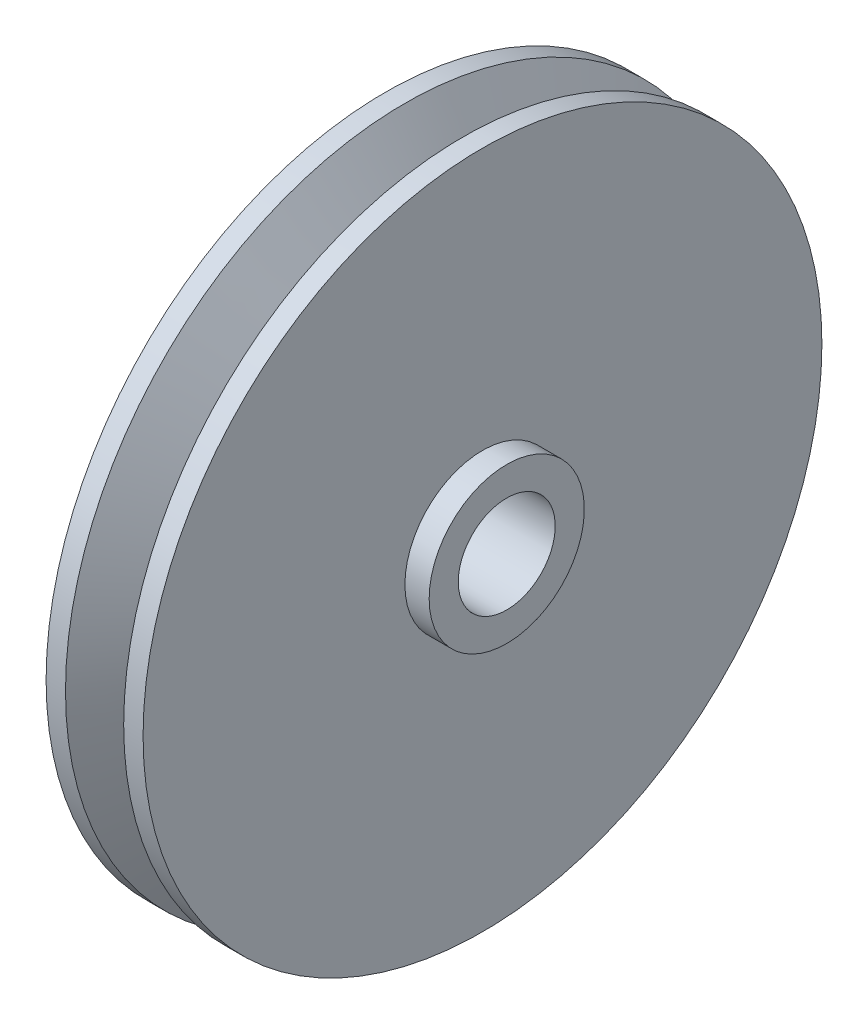
ISO-10303-21;
HEADER;
FILE_DESCRIPTION(('STEP AP214'),'2;1');
FILE_NAME('part.step','',(''),(''),'','','');
FILE_SCHEMA(('AUTOMOTIVE_DESIGN { 1 0 10303 214 1 1 1 1 }'));
ENDSEC;
DATA;
#1=APPLICATION_CONTEXT('core data for automotive mechanical design processes');
#2=APPLICATION_PROTOCOL_DEFINITION('international standard','automotive_design',2000,#1);
#3=PRODUCT_CONTEXT('',#1,'mechanical');
#4=PRODUCT('Part','Part','',(#3));
#5=PRODUCT_RELATED_PRODUCT_CATEGORY('part','',(#4));
#6=PRODUCT_DEFINITION_FORMATION('','',#4);
#7=PRODUCT_DEFINITION_CONTEXT('part definition',#1,'design');
#8=PRODUCT_DEFINITION('design','',#6,#7);
#9=PRODUCT_DEFINITION_SHAPE('','',#8);
#10=(LENGTH_UNIT() NAMED_UNIT(*) SI_UNIT(.MILLI.,.METRE.));
#11=(NAMED_UNIT(*) PLANE_ANGLE_UNIT() SI_UNIT($,.RADIAN.));
#12=(NAMED_UNIT(*) SI_UNIT($,.STERADIAN.) SOLID_ANGLE_UNIT());
#13=UNCERTAINTY_MEASURE_WITH_UNIT(LENGTH_MEASURE(1.E-05),#10,'distance_accuracy_value','');
#14=(GEOMETRIC_REPRESENTATION_CONTEXT(3) GLOBAL_UNCERTAINTY_ASSIGNED_CONTEXT((#13)) GLOBAL_UNIT_ASSIGNED_CONTEXT((#10,
#11,#12)) REPRESENTATION_CONTEXT('',''));
#15=CARTESIAN_POINT('',(0.,0.,0.));
#16=DIRECTION('',(0.,0.,1.));
#17=DIRECTION('',(1.,0.,0.));
#18=AXIS2_PLACEMENT_3D('',#15,#16,#17);
#19=CARTESIAN_POINT('',(0.,0.,0.));
#20=DIRECTION('',(-1.,0.,0.));
#21=DIRECTION('',(0.,0.,1.));
#22=AXIS2_PLACEMENT_3D('',#19,#20,#21);
#23=CYLINDRICAL_SURFACE('',#22,6.35);
#24=CARTESIAN_POINT('',(15.875,0.,0.));
#25=DIRECTION('',(-1.,0.,0.));
#26=DIRECTION('',(0.,0.,1.));
#27=AXIS2_PLACEMENT_3D('',#24,#25,#26);
#28=CIRCLE('',#27,6.35);
#29=CARTESIAN_POINT('',(15.875,0.,6.35));
#30=VERTEX_POINT('',#29);
#31=EDGE_CURVE('E63',#30,#30,#28,.T.);
#32=ORIENTED_EDGE('',*,*,#31,.F.);
#33=EDGE_LOOP('',(#32));
#34=FACE_BOUND('',#33,.T.);
#35=CARTESIAN_POINT('',(0.,0.,0.));
#36=DIRECTION('',(-1.,0.,0.));
#37=DIRECTION('',(0.,0.,1.));
#38=AXIS2_PLACEMENT_3D('',#35,#36,#37);
#39=CIRCLE('',#38,6.35);
#40=CARTESIAN_POINT('',(0.,0.,6.35));
#41=VERTEX_POINT('',#40);
#42=EDGE_CURVE('E10',#41,#41,#39,.T.);
#43=ORIENTED_EDGE('',*,*,#42,.T.);
#44=EDGE_LOOP('',(#43));
#45=FACE_BOUND('',#44,.T.);
#46=ADVANCED_FACE('F32',(#34,#45),#23,.F.);
#47=CARTESIAN_POINT('',(0.,6.35,0.));
#48=DIRECTION('',(1.,0.,0.));
#49=DIRECTION('',(0.,0.,-1.));
#50=AXIS2_PLACEMENT_3D('',#47,#48,#49);
#51=PLANE('',#50);
#52=ORIENTED_EDGE('',*,*,#42,.F.);
#53=EDGE_LOOP('',(#52));
#54=FACE_BOUND('',#53,.T.);
#55=CARTESIAN_POINT('',(0.,0.,0.));
#56=DIRECTION('',(-1.,0.,0.));
#57=DIRECTION('',(0.,0.,1.));
#58=AXIS2_PLACEMENT_3D('',#55,#56,#57);
#59=CIRCLE('',#58,44.45);
#60=CARTESIAN_POINT('',(0.,0.,44.45));
#61=VERTEX_POINT('',#60);
#62=EDGE_CURVE('E38',#61,#61,#59,.T.);
#63=ORIENTED_EDGE('',*,*,#62,.T.);
#64=EDGE_LOOP('',(#63));
#65=FACE_BOUND('',#64,.T.);
#66=ADVANCED_FACE('F70',(#54,#65),#51,.F.);
#67=CARTESIAN_POINT('',(0.,0.,0.));
#68=DIRECTION('',(-1.,0.,0.));
#69=DIRECTION('',(0.,0.,1.));
#70=AXIS2_PLACEMENT_3D('',#67,#68,#69);
#71=CYLINDRICAL_SURFACE('',#70,44.45);
#72=ORIENTED_EDGE('',*,*,#62,.F.);
#73=EDGE_LOOP('',(#72));
#74=FACE_BOUND('',#73,.T.);
#75=CARTESIAN_POINT('',(2.54,0.,0.));
#76=DIRECTION('',(-1.,0.,0.));
#77=DIRECTION('',(0.,0.,1.));
#78=AXIS2_PLACEMENT_3D('',#75,#76,#77);
#79=CIRCLE('',#78,44.45);
#80=CARTESIAN_POINT('',(2.54,0.,44.45));
#81=VERTEX_POINT('',#80);
#82=EDGE_CURVE('E42',#81,#81,#79,.T.);
#83=ORIENTED_EDGE('',*,*,#82,.T.);
#84=EDGE_LOOP('',(#83));
#85=FACE_BOUND('',#84,.T.);
#86=ADVANCED_FACE('F74',(#74,#85),#71,.T.);
#87=CARTESIAN_POINT('',(6.35,0.,0.));
#88=DIRECTION('',(-1.,0.,0.));
#89=DIRECTION('',(0.,0.,1.));
#90=AXIS2_PLACEMENT_3D('',#87,#88,#89);
#91=CONICAL_SURFACE('',#90,38.1,1.03037682652431);
#92=ORIENTED_EDGE('',*,*,#82,.F.);
#93=EDGE_LOOP('',(#92));
#94=FACE_BOUND('',#93,.T.);
#95=CARTESIAN_POINT('',(6.35,0.,0.));
#96=DIRECTION('',(-1.,0.,0.));
#97=DIRECTION('',(0.,0.,1.));
#98=AXIS2_PLACEMENT_3D('',#95,#96,#97);
#99=CIRCLE('',#98,38.1);
#100=CARTESIAN_POINT('',(6.35,0.,38.1));
#101=VERTEX_POINT('',#100);
#102=EDGE_CURVE('E46',#101,#101,#99,.T.);
#103=ORIENTED_EDGE('',*,*,#102,.T.);
#104=EDGE_LOOP('',(#103));
#105=FACE_BOUND('',#104,.T.);
#106=ADVANCED_FACE('F79',(#94,#105),#91,.T.);
#107=CARTESIAN_POINT('',(10.16,0.,0.));
#108=DIRECTION('',(1.,0.,0.));
#109=DIRECTION('',(0.,0.,-1.));
#110=AXIS2_PLACEMENT_3D('',#107,#108,#109);
#111=CONICAL_SURFACE('',#110,44.45,1.03037682652431);
#112=ORIENTED_EDGE('',*,*,#102,.F.);
#113=EDGE_LOOP('',(#112));
#114=FACE_BOUND('',#113,.T.);
#115=CARTESIAN_POINT('',(10.16,0.,0.));
#116=DIRECTION('',(-1.,0.,0.));
#117=DIRECTION('',(0.,0.,1.));
#118=AXIS2_PLACEMENT_3D('',#115,#116,#117);
#119=CIRCLE('',#118,44.45);
#120=CARTESIAN_POINT('',(10.16,0.,44.45));
#121=VERTEX_POINT('',#120);
#122=EDGE_CURVE('E51',#121,#121,#119,.T.);
#123=ORIENTED_EDGE('',*,*,#122,.T.);
#124=EDGE_LOOP('',(#123));
#125=FACE_BOUND('',#124,.T.);
#126=ADVANCED_FACE('F85',(#114,#125),#111,.T.);
#127=CARTESIAN_POINT('',(0.,0.,0.));
#128=DIRECTION('',(-1.,0.,0.));
#129=DIRECTION('',(0.,0.,1.));
#130=AXIS2_PLACEMENT_3D('',#127,#128,#129);
#131=CYLINDRICAL_SURFACE('',#130,44.45);
#132=ORIENTED_EDGE('',*,*,#122,.F.);
#133=EDGE_LOOP('',(#132));
#134=FACE_BOUND('',#133,.T.);
#135=CARTESIAN_POINT('',(12.7,0.,0.));
#136=DIRECTION('',(-1.,0.,0.));
#137=DIRECTION('',(0.,0.,1.));
#138=AXIS2_PLACEMENT_3D('',#135,#136,#137);
#139=CIRCLE('',#138,44.45);
#140=CARTESIAN_POINT('',(12.7,0.,44.45));
#141=VERTEX_POINT('',#140);
#142=EDGE_CURVE('E54',#141,#141,#139,.T.);
#143=ORIENTED_EDGE('',*,*,#142,.T.);
#144=EDGE_LOOP('',(#143));
#145=FACE_BOUND('',#144,.T.);
#146=ADVANCED_FACE('F89',(#134,#145),#131,.T.);
#147=CARTESIAN_POINT('',(12.7,44.45,0.));
#148=DIRECTION('',(-1.,0.,0.));
#149=DIRECTION('',(0.,0.,1.));
#150=AXIS2_PLACEMENT_3D('',#147,#148,#149);
#151=PLANE('',#150);
#152=ORIENTED_EDGE('',*,*,#142,.F.);
#153=EDGE_LOOP('',(#152));
#154=FACE_BOUND('',#153,.T.);
#155=CARTESIAN_POINT('',(12.7,0.,0.));
#156=DIRECTION('',(-1.,0.,0.));
#157=DIRECTION('',(0.,0.,1.));
#158=AXIS2_PLACEMENT_3D('',#155,#156,#157);
#159=CIRCLE('',#158,10.16);
#160=CARTESIAN_POINT('',(12.7,0.,10.16));
#161=VERTEX_POINT('',#160);
#162=EDGE_CURVE('E57',#161,#161,#159,.T.);
#163=ORIENTED_EDGE('',*,*,#162,.T.);
#164=EDGE_LOOP('',(#163));
#165=FACE_BOUND('',#164,.T.);
#166=ADVANCED_FACE('F93',(#154,#165),#151,.F.);
#167=CARTESIAN_POINT('',(0.,0.,0.));
#168=DIRECTION('',(-1.,0.,0.));
#169=DIRECTION('',(0.,0.,1.));
#170=AXIS2_PLACEMENT_3D('',#167,#168,#169);
#171=CYLINDRICAL_SURFACE('',#170,10.16);
#172=ORIENTED_EDGE('',*,*,#162,.F.);
#173=EDGE_LOOP('',(#172));
#174=FACE_BOUND('',#173,.T.);
#175=CARTESIAN_POINT('',(15.875,0.,0.));
#176=DIRECTION('',(-1.,0.,0.));
#177=DIRECTION('',(0.,0.,1.));
#178=AXIS2_PLACEMENT_3D('',#175,#176,#177);
#179=CIRCLE('',#178,10.16);
#180=CARTESIAN_POINT('',(15.875,0.,10.16));
#181=VERTEX_POINT('',#180);
#182=EDGE_CURVE('E60',#181,#181,#179,.T.);
#183=ORIENTED_EDGE('',*,*,#182,.T.);
#184=EDGE_LOOP('',(#183));
#185=FACE_BOUND('',#184,.T.);
#186=ADVANCED_FACE('F97',(#174,#185),#171,.T.);
#187=CARTESIAN_POINT('',(15.875,10.16,0.));
#188=DIRECTION('',(-1.,0.,0.));
#189=DIRECTION('',(0.,0.,1.));
#190=AXIS2_PLACEMENT_3D('',#187,#188,#189);
#191=PLANE('',#190);
#192=ORIENTED_EDGE('',*,*,#182,.F.);
#193=EDGE_LOOP('',(#192));
#194=FACE_BOUND('',#193,.T.);
#195=ORIENTED_EDGE('',*,*,#31,.T.);
#196=EDGE_LOOP('',(#195));
#197=FACE_BOUND('',#196,.T.);
#198=ADVANCED_FACE('F67',(#194,#197),#191,.F.);
#199=CLOSED_SHELL('',(#46,#66,#86,#106,#126,#146,#166,#186,#198));
#200=MANIFOLD_SOLID_BREP('B2',#199);
#201=ADVANCED_BREP_SHAPE_REPRESENTATION('',(#18,#200),#14);
#202=SHAPE_DEFINITION_REPRESENTATION(#9,#201);
ENDSEC;
END-ISO-10303-21;
